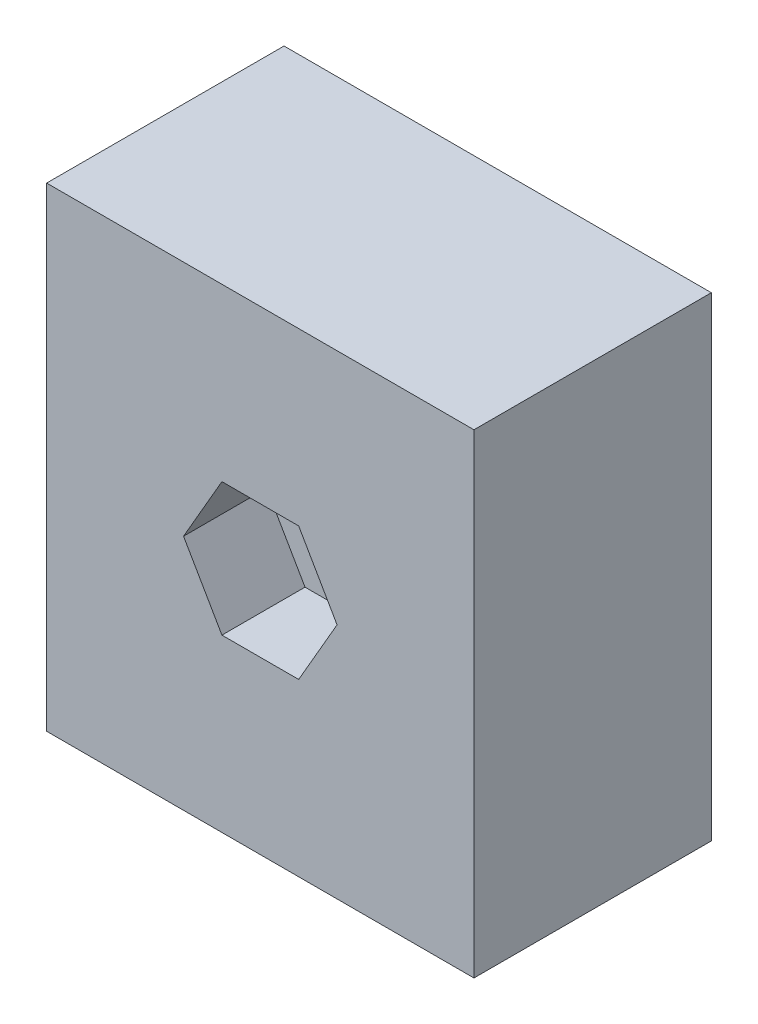
ISO-10303-21;
HEADER;
FILE_DESCRIPTION(('STEP AP214'),'2;1');
FILE_NAME('part.step','',(''),(''),'','','');
FILE_SCHEMA(('AUTOMOTIVE_DESIGN { 1 0 10303 214 1 1 1 1 }'));
ENDSEC;
DATA;
#1=APPLICATION_CONTEXT('core data for automotive mechanical design processes');
#2=APPLICATION_PROTOCOL_DEFINITION('international standard','automotive_design',2000,#1);
#3=PRODUCT_CONTEXT('',#1,'mechanical');
#4=PRODUCT('Part','Part','',(#3));
#5=PRODUCT_RELATED_PRODUCT_CATEGORY('part','',(#4));
#6=PRODUCT_DEFINITION_FORMATION('','',#4);
#7=PRODUCT_DEFINITION_CONTEXT('part definition',#1,'design');
#8=PRODUCT_DEFINITION('design','',#6,#7);
#9=PRODUCT_DEFINITION_SHAPE('','',#8);
#10=(LENGTH_UNIT() NAMED_UNIT(*) SI_UNIT(.MILLI.,.METRE.));
#11=(NAMED_UNIT(*) PLANE_ANGLE_UNIT() SI_UNIT($,.RADIAN.));
#12=(NAMED_UNIT(*) SI_UNIT($,.STERADIAN.) SOLID_ANGLE_UNIT());
#13=UNCERTAINTY_MEASURE_WITH_UNIT(LENGTH_MEASURE(1.E-05),#10,'distance_accuracy_value','');
#14=(GEOMETRIC_REPRESENTATION_CONTEXT(3) GLOBAL_UNCERTAINTY_ASSIGNED_CONTEXT((#13)) GLOBAL_UNIT_ASSIGNED_CONTEXT((#10,
#11,#12)) REPRESENTATION_CONTEXT('',''));
#15=CARTESIAN_POINT('',(0.,0.,0.));
#16=DIRECTION('',(0.,0.,1.));
#17=DIRECTION('',(1.,0.,0.));
#18=AXIS2_PLACEMENT_3D('',#15,#16,#17);
#19=CARTESIAN_POINT('',(0.,0.,0.));
#20=DIRECTION('',(0.,0.,1.));
#21=DIRECTION('',(1.,0.,0.));
#22=AXIS2_PLACEMENT_3D('',#19,#20,#21);
#23=CYLINDRICAL_SURFACE('',#22,1.8);
#24=CARTESIAN_POINT('',(0.,0.,0.));
#25=DIRECTION('',(0.,0.,1.));
#26=DIRECTION('',(1.,0.,0.));
#27=AXIS2_PLACEMENT_3D('',#24,#25,#26);
#28=CIRCLE('',#27,1.8);
#29=CARTESIAN_POINT('',(1.8,0.,0.));
#30=VERTEX_POINT('',#29);
#31=EDGE_CURVE('E206',#30,#30,#28,.T.);
#32=ORIENTED_EDGE('',*,*,#31,.F.);
#33=EDGE_LOOP('',(#32));
#34=FACE_BOUND('',#33,.T.);
#35=CARTESIAN_POINT('',(0.,0.,6.5));
#36=DIRECTION('',(0.,0.,1.));
#37=DIRECTION('',(1.,0.,0.));
#38=AXIS2_PLACEMENT_3D('',#35,#36,#37);
#39=CIRCLE('',#38,1.8);
#40=CARTESIAN_POINT('',(1.8,0.,6.5));
#41=VERTEX_POINT('',#40);
#42=EDGE_CURVE('E49',#41,#41,#39,.F.);
#43=ORIENTED_EDGE('',*,*,#42,.F.);
#44=EDGE_LOOP('',(#43));
#45=FACE_BOUND('',#44,.T.);
#46=ADVANCED_FACE('F45',(#34,#45),#23,.F.);
#47=CARTESIAN_POINT('',(9.,-10.,10.));
#48=DIRECTION('',(-1.,0.,0.));
#49=DIRECTION('',(0.,0.,1.));
#50=AXIS2_PLACEMENT_3D('',#47,#48,#49);
#51=PLANE('',#50);
#52=DIRECTION('',(0.,1.,0.));
#53=VECTOR('',#52,1.);
#54=CARTESIAN_POINT('',(9.,-10.,0.));
#55=LINE('',#54,#53);
#56=CARTESIAN_POINT('',(9.,-10.,0.));
#57=VERTEX_POINT('',#56);
#58=CARTESIAN_POINT('',(9.,10.,0.));
#59=VERTEX_POINT('',#58);
#60=EDGE_CURVE('E210',#57,#59,#55,.T.);
#61=ORIENTED_EDGE('',*,*,#60,.T.);
#62=DIRECTION('',(0.,0.,-1.));
#63=VECTOR('',#62,1.);
#64=CARTESIAN_POINT('',(9.,10.,10.));
#65=LINE('',#64,#63);
#66=CARTESIAN_POINT('',(9.,10.,10.));
#67=VERTEX_POINT('',#66);
#68=EDGE_CURVE('E12',#67,#59,#65,.T.);
#69=ORIENTED_EDGE('',*,*,#68,.F.);
#70=DIRECTION('',(0.,1.,0.));
#71=VECTOR('',#70,1.);
#72=CARTESIAN_POINT('',(9.,-10.,10.));
#73=LINE('',#72,#71);
#74=CARTESIAN_POINT('',(9.,-10.,10.));
#75=VERTEX_POINT('',#74);
#76=EDGE_CURVE('E211',#75,#67,#73,.T.);
#77=ORIENTED_EDGE('',*,*,#76,.F.);
#78=DIRECTION('',(0.,0.,-1.));
#79=VECTOR('',#78,1.);
#80=CARTESIAN_POINT('',(9.,-10.,10.));
#81=LINE('',#80,#79);
#82=EDGE_CURVE('E221',#75,#57,#81,.T.);
#83=ORIENTED_EDGE('',*,*,#82,.T.);
#84=EDGE_LOOP('',(#61,#69,#77,#83));
#85=FACE_BOUND('',#84,.T.);
#86=ADVANCED_FACE('F47',(#85),#51,.F.);
#87=CARTESIAN_POINT('',(-9.,10.,10.));
#88=DIRECTION('',(0.,-1.,0.));
#89=DIRECTION('',(0.,0.,-1.));
#90=AXIS2_PLACEMENT_3D('',#87,#88,#89);
#91=PLANE('',#90);
#92=DIRECTION('',(-1.,0.,0.));
#93=VECTOR('',#92,1.);
#94=CARTESIAN_POINT('',(-9.,10.,0.));
#95=LINE('',#94,#93);
#96=CARTESIAN_POINT('',(-9.,10.,0.));
#97=VERTEX_POINT('',#96);
#98=EDGE_CURVE('E225',#59,#97,#95,.T.);
#99=ORIENTED_EDGE('',*,*,#98,.T.);
#100=DIRECTION('',(0.,0.,-1.));
#101=VECTOR('',#100,1.);
#102=CARTESIAN_POINT('',(-9.,10.,10.));
#103=LINE('',#102,#101);
#104=CARTESIAN_POINT('',(-9.,10.,10.));
#105=VERTEX_POINT('',#104);
#106=EDGE_CURVE('E55',#105,#97,#103,.T.);
#107=ORIENTED_EDGE('',*,*,#106,.F.);
#108=DIRECTION('',(-1.,0.,0.));
#109=VECTOR('',#108,1.);
#110=CARTESIAN_POINT('',(-9.,10.,10.));
#111=LINE('',#110,#109);
#112=EDGE_CURVE('E99',#67,#105,#111,.T.);
#113=ORIENTED_EDGE('',*,*,#112,.F.);
#114=ORIENTED_EDGE('',*,*,#68,.T.);
#115=EDGE_LOOP('',(#99,#107,#113,#114));
#116=FACE_BOUND('',#115,.T.);
#117=ADVANCED_FACE('F261',(#116),#91,.F.);
#118=CARTESIAN_POINT('',(-9.,-10.,10.));
#119=DIRECTION('',(1.,0.,0.));
#120=DIRECTION('',(0.,0.,-1.));
#121=AXIS2_PLACEMENT_3D('',#118,#119,#120);
#122=PLANE('',#121);
#123=DIRECTION('',(0.,-1.,0.));
#124=VECTOR('',#123,1.);
#125=CARTESIAN_POINT('',(-9.,-10.,0.));
#126=LINE('',#125,#124);
#127=CARTESIAN_POINT('',(-9.,-10.,0.));
#128=VERTEX_POINT('',#127);
#129=EDGE_CURVE('E228',#97,#128,#126,.T.);
#130=ORIENTED_EDGE('',*,*,#129,.T.);
#131=DIRECTION('',(0.,0.,-1.));
#132=VECTOR('',#131,1.);
#133=CARTESIAN_POINT('',(-9.,-10.,10.));
#134=LINE('',#133,#132);
#135=CARTESIAN_POINT('',(-9.,-10.,10.));
#136=VERTEX_POINT('',#135);
#137=EDGE_CURVE('E235',#136,#128,#134,.T.);
#138=ORIENTED_EDGE('',*,*,#137,.F.);
#139=DIRECTION('',(0.,-1.,0.));
#140=VECTOR('',#139,1.);
#141=CARTESIAN_POINT('',(-9.,-10.,10.));
#142=LINE('',#141,#140);
#143=EDGE_CURVE('E216',#105,#136,#142,.T.);
#144=ORIENTED_EDGE('',*,*,#143,.F.);
#145=ORIENTED_EDGE('',*,*,#106,.T.);
#146=EDGE_LOOP('',(#130,#138,#144,#145));
#147=FACE_BOUND('',#146,.T.);
#148=ADVANCED_FACE('F243',(#147),#122,.F.);
#149=CARTESIAN_POINT('',(-9.,-10.,10.));
#150=DIRECTION('',(0.,1.,0.));
#151=DIRECTION('',(0.,0.,1.));
#152=AXIS2_PLACEMENT_3D('',#149,#150,#151);
#153=PLANE('',#152);
#154=DIRECTION('',(1.,0.,0.));
#155=VECTOR('',#154,1.);
#156=CARTESIAN_POINT('',(-9.,-10.,0.));
#157=LINE('',#156,#155);
#158=EDGE_CURVE('E92',#128,#57,#157,.T.);
#159=ORIENTED_EDGE('',*,*,#158,.T.);
#160=ORIENTED_EDGE('',*,*,#82,.F.);
#161=DIRECTION('',(1.,0.,0.));
#162=VECTOR('',#161,1.);
#163=CARTESIAN_POINT('',(-9.,-10.,10.));
#164=LINE('',#163,#162);
#165=EDGE_CURVE('E71',#136,#75,#164,.T.);
#166=ORIENTED_EDGE('',*,*,#165,.F.);
#167=ORIENTED_EDGE('',*,*,#137,.T.);
#168=EDGE_LOOP('',(#159,#160,#166,#167));
#169=FACE_BOUND('',#168,.T.);
#170=ADVANCED_FACE('F251',(#169),#153,.F.);
#171=CARTESIAN_POINT('',(0.,0.,10.));
#172=DIRECTION('',(0.,0.,-1.));
#173=DIRECTION('',(-1.,0.,0.));
#174=AXIS2_PLACEMENT_3D('',#171,#172,#173);
#175=PLANE('',#174);
#176=DIRECTION('',(-1.,0.,0.));
#177=VECTOR('',#176,1.);
#178=CARTESIAN_POINT('',(1.61658075373095,2.8,10.));
#179=LINE('',#178,#177);
#180=CARTESIAN_POINT('',(1.61658075373095,2.8,10.));
#181=VERTEX_POINT('',#180);
#182=CARTESIAN_POINT('',(-1.61658075373095,2.8,10.));
#183=VERTEX_POINT('',#182);
#184=EDGE_CURVE('E178',#181,#183,#179,.T.);
#185=ORIENTED_EDGE('',*,*,#184,.F.);
#186=DIRECTION('',(-0.5,0.866025403784438,0.));
#187=VECTOR('',#186,1.);
#188=CARTESIAN_POINT('',(3.2331615074619,0.,10.));
#189=LINE('',#188,#187);
#190=CARTESIAN_POINT('',(3.2331615074619,0.,10.));
#191=VERTEX_POINT('',#190);
#192=EDGE_CURVE('E62',#191,#181,#189,.T.);
#193=ORIENTED_EDGE('',*,*,#192,.F.);
#194=DIRECTION('',(0.5,0.866025403784439,0.));
#195=VECTOR('',#194,1.);
#196=CARTESIAN_POINT('',(1.61658075373095,-2.8,10.));
#197=LINE('',#196,#195);
#198=CARTESIAN_POINT('',(1.61658075373095,-2.8,10.));
#199=VERTEX_POINT('',#198);
#200=EDGE_CURVE('E158',#199,#191,#197,.T.);
#201=ORIENTED_EDGE('',*,*,#200,.F.);
#202=DIRECTION('',(1.,0.,0.));
#203=VECTOR('',#202,1.);
#204=CARTESIAN_POINT('',(-1.61658075373095,-2.8,10.));
#205=LINE('',#204,#203);
#206=CARTESIAN_POINT('',(-1.61658075373095,-2.8,10.));
#207=VERTEX_POINT('',#206);
#208=EDGE_CURVE('E162',#207,#199,#205,.T.);
#209=ORIENTED_EDGE('',*,*,#208,.F.);
#210=DIRECTION('',(0.5,-0.866025403784439,0.));
#211=VECTOR('',#210,1.);
#212=CARTESIAN_POINT('',(-3.2331615074619,0.,10.));
#213=LINE('',#212,#211);
#214=CARTESIAN_POINT('',(-3.2331615074619,0.,10.));
#215=VERTEX_POINT('',#214);
#216=EDGE_CURVE('E185',#215,#207,#213,.T.);
#217=ORIENTED_EDGE('',*,*,#216,.F.);
#218=DIRECTION('',(-0.5,-0.866025403784439,0.));
#219=VECTOR('',#218,1.);
#220=CARTESIAN_POINT('',(-1.61658075373095,2.8,10.));
#221=LINE('',#220,#219);
#222=EDGE_CURVE('E181',#183,#215,#221,.T.);
#223=ORIENTED_EDGE('',*,*,#222,.F.);
#224=EDGE_LOOP('',(#185,#193,#201,#209,#217,#223));
#225=FACE_BOUND('',#224,.T.);
#226=ORIENTED_EDGE('',*,*,#76,.T.);
#227=ORIENTED_EDGE('',*,*,#112,.T.);
#228=ORIENTED_EDGE('',*,*,#143,.T.);
#229=ORIENTED_EDGE('',*,*,#165,.T.);
#230=EDGE_LOOP('',(#226,#227,#228,#229));
#231=FACE_BOUND('',#230,.T.);
#232=ADVANCED_FACE('F253',(#225,#231),#175,.F.);
#233=CARTESIAN_POINT('',(0.,0.,0.));
#234=DIRECTION('',(0.,0.,-1.));
#235=DIRECTION('',(-1.,0.,0.));
#236=AXIS2_PLACEMENT_3D('',#233,#234,#235);
#237=PLANE('',#236);
#238=ORIENTED_EDGE('',*,*,#31,.T.);
#239=EDGE_LOOP('',(#238));
#240=FACE_BOUND('',#239,.T.);
#241=ORIENTED_EDGE('',*,*,#60,.F.);
#242=ORIENTED_EDGE('',*,*,#158,.F.);
#243=ORIENTED_EDGE('',*,*,#129,.F.);
#244=ORIENTED_EDGE('',*,*,#98,.F.);
#245=EDGE_LOOP('',(#241,#242,#243,#244));
#246=FACE_BOUND('',#245,.T.);
#247=ADVANCED_FACE('F247',(#240,#246),#237,.T.);
#248=CARTESIAN_POINT('',(0.,0.,6.5));
#249=DIRECTION('',(0.,0.,1.));
#250=DIRECTION('',(1.,0.,0.));
#251=AXIS2_PLACEMENT_3D('',#248,#249,#250);
#252=PLANE('',#251);
#253=DIRECTION('',(-0.5,0.866025403784438,0.));
#254=VECTOR('',#253,1.);
#255=CARTESIAN_POINT('',(3.2331615074619,0.,6.5));
#256=LINE('',#255,#254);
#257=CARTESIAN_POINT('',(3.2331615074619,0.,6.5));
#258=VERTEX_POINT('',#257);
#259=CARTESIAN_POINT('',(1.61658075373095,2.8,6.5));
#260=VERTEX_POINT('',#259);
#261=EDGE_CURVE('E135',#258,#260,#256,.T.);
#262=ORIENTED_EDGE('',*,*,#261,.T.);
#263=DIRECTION('',(-1.,0.,0.));
#264=VECTOR('',#263,1.);
#265=CARTESIAN_POINT('',(1.61658075373095,2.8,6.5));
#266=LINE('',#265,#264);
#267=CARTESIAN_POINT('',(-1.61658075373095,2.8,6.5));
#268=VERTEX_POINT('',#267);
#269=EDGE_CURVE('E145',#260,#268,#266,.T.);
#270=ORIENTED_EDGE('',*,*,#269,.T.);
#271=DIRECTION('',(-0.5,-0.866025403784439,0.));
#272=VECTOR('',#271,1.);
#273=CARTESIAN_POINT('',(-1.61658075373095,2.8,6.5));
#274=LINE('',#273,#272);
#275=CARTESIAN_POINT('',(-3.2331615074619,0.,6.5));
#276=VERTEX_POINT('',#275);
#277=EDGE_CURVE('E151',#268,#276,#274,.T.);
#278=ORIENTED_EDGE('',*,*,#277,.T.);
#279=DIRECTION('',(0.5,-0.866025403784439,0.));
#280=VECTOR('',#279,1.);
#281=CARTESIAN_POINT('',(-3.2331615074619,0.,6.5));
#282=LINE('',#281,#280);
#283=CARTESIAN_POINT('',(-1.61658075373095,-2.8,6.5));
#284=VERTEX_POINT('',#283);
#285=EDGE_CURVE('E167',#276,#284,#282,.T.);
#286=ORIENTED_EDGE('',*,*,#285,.T.);
#287=DIRECTION('',(1.,0.,0.));
#288=VECTOR('',#287,1.);
#289=CARTESIAN_POINT('',(-1.61658075373095,-2.8,6.5));
#290=LINE('',#289,#288);
#291=CARTESIAN_POINT('',(1.61658075373095,-2.8,6.5));
#292=VERTEX_POINT('',#291);
#293=EDGE_CURVE('E171',#284,#292,#290,.T.);
#294=ORIENTED_EDGE('',*,*,#293,.T.);
#295=DIRECTION('',(0.5,0.866025403784439,0.));
#296=VECTOR('',#295,1.);
#297=CARTESIAN_POINT('',(1.61658075373095,-2.8,6.5));
#298=LINE('',#297,#296);
#299=EDGE_CURVE('E142',#292,#258,#298,.T.);
#300=ORIENTED_EDGE('',*,*,#299,.T.);
#301=EDGE_LOOP('',(#262,#270,#278,#286,#294,#300));
#302=FACE_BOUND('',#301,.T.);
#303=ORIENTED_EDGE('',*,*,#42,.T.);
#304=EDGE_LOOP('',(#303));
#305=FACE_BOUND('',#304,.T.);
#306=ADVANCED_FACE('F153',(#302,#305),#252,.T.);
#307=CARTESIAN_POINT('',(3.2331615074619,0.,6.5));
#308=DIRECTION('',(0.866025403784438,0.5,0.));
#309=DIRECTION('',(-0.5,0.866025403784439,0.));
#310=AXIS2_PLACEMENT_3D('',#307,#308,#309);
#311=PLANE('',#310);
#312=ORIENTED_EDGE('',*,*,#192,.T.);
#313=DIRECTION('',(0.,0.,1.));
#314=VECTOR('',#313,1.);
#315=CARTESIAN_POINT('',(1.61658075373095,2.8,6.5));
#316=LINE('',#315,#314);
#317=EDGE_CURVE('E131',#260,#181,#316,.T.);
#318=ORIENTED_EDGE('',*,*,#317,.F.);
#319=ORIENTED_EDGE('',*,*,#261,.F.);
#320=DIRECTION('',(0.,0.,1.));
#321=VECTOR('',#320,1.);
#322=CARTESIAN_POINT('',(3.2331615074619,0.,6.5));
#323=LINE('',#322,#321);
#324=EDGE_CURVE('E192',#258,#191,#323,.T.);
#325=ORIENTED_EDGE('',*,*,#324,.T.);
#326=EDGE_LOOP('',(#312,#318,#319,#325));
#327=FACE_BOUND('',#326,.T.);
#328=ADVANCED_FACE('F133',(#327),#311,.F.);
#329=CARTESIAN_POINT('',(1.61658075373095,-2.8,6.5));
#330=DIRECTION('',(0.866025403784439,-0.5,0.));
#331=DIRECTION('',(0.5,0.866025403784439,0.));
#332=AXIS2_PLACEMENT_3D('',#329,#330,#331);
#333=PLANE('',#332);
#334=ORIENTED_EDGE('',*,*,#200,.T.);
#335=ORIENTED_EDGE('',*,*,#324,.F.);
#336=ORIENTED_EDGE('',*,*,#299,.F.);
#337=DIRECTION('',(0.,0.,1.));
#338=VECTOR('',#337,1.);
#339=CARTESIAN_POINT('',(1.61658075373095,-2.8,6.5));
#340=LINE('',#339,#338);
#341=EDGE_CURVE('E195',#292,#199,#340,.T.);
#342=ORIENTED_EDGE('',*,*,#341,.T.);
#343=EDGE_LOOP('',(#334,#335,#336,#342));
#344=FACE_BOUND('',#343,.T.);
#345=ADVANCED_FACE('F283',(#344),#333,.F.);
#346=CARTESIAN_POINT('',(-1.61658075373095,-2.8,6.5));
#347=DIRECTION('',(0.,-1.,0.));
#348=DIRECTION('',(0.,0.,-1.));
#349=AXIS2_PLACEMENT_3D('',#346,#347,#348);
#350=PLANE('',#349);
#351=ORIENTED_EDGE('',*,*,#208,.T.);
#352=ORIENTED_EDGE('',*,*,#341,.F.);
#353=ORIENTED_EDGE('',*,*,#293,.F.);
#354=DIRECTION('',(0.,0.,1.));
#355=VECTOR('',#354,1.);
#356=CARTESIAN_POINT('',(-1.61658075373095,-2.8,6.5));
#357=LINE('',#356,#355);
#358=EDGE_CURVE('E198',#284,#207,#357,.T.);
#359=ORIENTED_EDGE('',*,*,#358,.T.);
#360=EDGE_LOOP('',(#351,#352,#353,#359));
#361=FACE_BOUND('',#360,.T.);
#362=ADVANCED_FACE('F287',(#361),#350,.F.);
#363=CARTESIAN_POINT('',(-3.2331615074619,0.,6.5));
#364=DIRECTION('',(-0.866025403784439,-0.5,0.));
#365=DIRECTION('',(0.5,-0.866025403784439,0.));
#366=AXIS2_PLACEMENT_3D('',#363,#364,#365);
#367=PLANE('',#366);
#368=ORIENTED_EDGE('',*,*,#216,.T.);
#369=ORIENTED_EDGE('',*,*,#358,.F.);
#370=ORIENTED_EDGE('',*,*,#285,.F.);
#371=DIRECTION('',(0.,0.,1.));
#372=VECTOR('',#371,1.);
#373=CARTESIAN_POINT('',(-3.2331615074619,0.,6.5));
#374=LINE('',#373,#372);
#375=EDGE_CURVE('E201',#276,#215,#374,.T.);
#376=ORIENTED_EDGE('',*,*,#375,.T.);
#377=EDGE_LOOP('',(#368,#369,#370,#376));
#378=FACE_BOUND('',#377,.T.);
#379=ADVANCED_FACE('F291',(#378),#367,.F.);
#380=CARTESIAN_POINT('',(-1.61658075373095,2.8,6.5));
#381=DIRECTION('',(-0.866025403784439,0.5,0.));
#382=DIRECTION('',(-0.5,-0.866025403784439,0.));
#383=AXIS2_PLACEMENT_3D('',#380,#381,#382);
#384=PLANE('',#383);
#385=ORIENTED_EDGE('',*,*,#222,.T.);
#386=ORIENTED_EDGE('',*,*,#375,.F.);
#387=ORIENTED_EDGE('',*,*,#277,.F.);
#388=DIRECTION('',(0.,0.,1.));
#389=VECTOR('',#388,1.);
#390=CARTESIAN_POINT('',(-1.61658075373095,2.8,6.5));
#391=LINE('',#390,#389);
#392=EDGE_CURVE('E141',#268,#183,#391,.T.);
#393=ORIENTED_EDGE('',*,*,#392,.T.);
#394=EDGE_LOOP('',(#385,#386,#387,#393));
#395=FACE_BOUND('',#394,.T.);
#396=ADVANCED_FACE('F295',(#395),#384,.F.);
#397=CARTESIAN_POINT('',(1.61658075373095,2.8,6.5));
#398=DIRECTION('',(0.,1.,0.));
#399=DIRECTION('',(-1.,0.,0.));
#400=AXIS2_PLACEMENT_3D('',#397,#398,#399);
#401=PLANE('',#400);
#402=ORIENTED_EDGE('',*,*,#184,.T.);
#403=ORIENTED_EDGE('',*,*,#392,.F.);
#404=ORIENTED_EDGE('',*,*,#269,.F.);
#405=ORIENTED_EDGE('',*,*,#317,.T.);
#406=EDGE_LOOP('',(#402,#403,#404,#405));
#407=FACE_BOUND('',#406,.T.);
#408=ADVANCED_FACE('F146',(#407),#401,.F.);
#409=CLOSED_SHELL('',(#46,#86,#117,#148,#170,#232,#247,#306,#328,#345,#362,#379,#396,#408));
#410=MANIFOLD_SOLID_BREP('B2',#409);
#411=ADVANCED_BREP_SHAPE_REPRESENTATION('',(#18,#410),#14);
#412=SHAPE_DEFINITION_REPRESENTATION(#9,#411);
ENDSEC;
END-ISO-10303-21;
